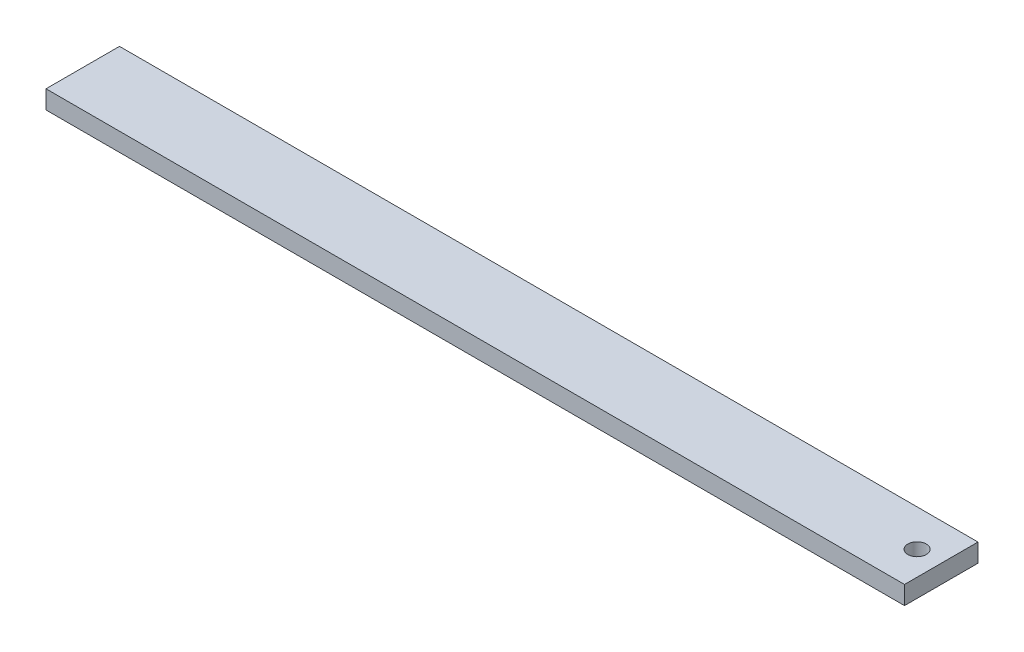
ISO-10303-21;
HEADER;
FILE_DESCRIPTION(('STEP AP214'),'2;1');
FILE_NAME('part.step','',(''),(''),'','','');
FILE_SCHEMA(('AUTOMOTIVE_DESIGN { 1 0 10303 214 1 1 1 1 }'));
ENDSEC;
DATA;
#1=APPLICATION_CONTEXT('core data for automotive mechanical design processes');
#2=APPLICATION_PROTOCOL_DEFINITION('international standard','automotive_design',2000,#1);
#3=PRODUCT_CONTEXT('',#1,'mechanical');
#4=PRODUCT('Part','Part','',(#3));
#5=PRODUCT_RELATED_PRODUCT_CATEGORY('part','',(#4));
#6=PRODUCT_DEFINITION_FORMATION('','',#4);
#7=PRODUCT_DEFINITION_CONTEXT('part definition',#1,'design');
#8=PRODUCT_DEFINITION('design','',#6,#7);
#9=PRODUCT_DEFINITION_SHAPE('','',#8);
#10=(LENGTH_UNIT() NAMED_UNIT(*) SI_UNIT(.MILLI.,.METRE.));
#11=(NAMED_UNIT(*) PLANE_ANGLE_UNIT() SI_UNIT($,.RADIAN.));
#12=(NAMED_UNIT(*) SI_UNIT($,.STERADIAN.) SOLID_ANGLE_UNIT());
#13=UNCERTAINTY_MEASURE_WITH_UNIT(LENGTH_MEASURE(1.E-05),#10,'distance_accuracy_value','');
#14=(GEOMETRIC_REPRESENTATION_CONTEXT(3) GLOBAL_UNCERTAINTY_ASSIGNED_CONTEXT((#13)) GLOBAL_UNIT_ASSIGNED_CONTEXT((#10,
#11,#12)) REPRESENTATION_CONTEXT('',''));
#15=CARTESIAN_POINT('',(0.,0.,0.));
#16=DIRECTION('',(0.,0.,1.));
#17=DIRECTION('',(1.,0.,0.));
#18=AXIS2_PLACEMENT_3D('',#15,#16,#17);
#19=CARTESIAN_POINT('',(-140.2,3.,6.));
#20=DIRECTION('',(0.,0.,-1.));
#21=DIRECTION('',(-1.,0.,0.));
#22=AXIS2_PLACEMENT_3D('',#19,#20,#21);
#23=PLANE('',#22);
#24=DIRECTION('',(0.,1.,0.));
#25=VECTOR('',#24,1.);
#26=CARTESIAN_POINT('',(0.,0.,6.));
#27=LINE('',#26,#25);
#28=CARTESIAN_POINT('',(0.,0.,6.));
#29=VERTEX_POINT('',#28);
#30=CARTESIAN_POINT('',(0.,3.,6.));
#31=VERTEX_POINT('',#30);
#32=EDGE_CURVE('E148',#29,#31,#27,.T.);
#33=ORIENTED_EDGE('',*,*,#32,.F.);
#34=DIRECTION('',(1.,0.,0.));
#35=VECTOR('',#34,1.);
#36=CARTESIAN_POINT('',(-140.2,0.,6.));
#37=LINE('',#36,#35);
#38=CARTESIAN_POINT('',(140.2,0.,6.));
#39=VERTEX_POINT('',#38);
#40=EDGE_CURVE('E164',#29,#39,#37,.T.);
#41=ORIENTED_EDGE('',*,*,#40,.T.);
#42=DIRECTION('',(0.,-1.,0.));
#43=VECTOR('',#42,1.);
#44=CARTESIAN_POINT('',(140.2,3.,6.));
#45=LINE('',#44,#43);
#46=CARTESIAN_POINT('',(140.2,3.,6.));
#47=VERTEX_POINT('',#46);
#48=EDGE_CURVE('E167',#47,#39,#45,.T.);
#49=ORIENTED_EDGE('',*,*,#48,.F.);
#50=DIRECTION('',(1.,0.,0.));
#51=VECTOR('',#50,1.);
#52=CARTESIAN_POINT('',(-140.2,3.,6.));
#53=LINE('',#52,#51);
#54=EDGE_CURVE('E166',#31,#47,#53,.T.);
#55=ORIENTED_EDGE('',*,*,#54,.F.);
#56=EDGE_LOOP('',(#33,#41,#49,#55));
#57=FACE_BOUND('',#56,.T.);
#58=ADVANCED_FACE('F39',(#57),#23,.F.);
#59=CARTESIAN_POINT('',(0.,3.,0.));
#60=DIRECTION('',(0.,-1.,0.));
#61=DIRECTION('',(0.,0.,-1.));
#62=AXIS2_PLACEMENT_3D('',#59,#60,#61);
#63=PLANE('',#62);
#64=CARTESIAN_POINT('',(136.25,3.,0.));
#65=DIRECTION('',(0.,1.,0.));
#66=DIRECTION('',(0.,0.,1.));
#67=AXIS2_PLACEMENT_3D('',#64,#65,#66);
#68=CIRCLE('',#67,1.5);
#69=CARTESIAN_POINT('',(136.25,3.,1.49999999999995));
#70=VERTEX_POINT('',#69);
#71=EDGE_CURVE('E155',#70,#70,#68,.T.);
#72=ORIENTED_EDGE('',*,*,#71,.F.);
#73=EDGE_LOOP('',(#72));
#74=FACE_BOUND('',#73,.T.);
#75=DIRECTION('',(0.,0.,-1.));
#76=VECTOR('',#75,1.);
#77=CARTESIAN_POINT('',(0.,3.,6.));
#78=LINE('',#77,#76);
#79=CARTESIAN_POINT('',(0.,3.,-6.));
#80=VERTEX_POINT('',#79);
#81=EDGE_CURVE('E145',#31,#80,#78,.T.);
#82=ORIENTED_EDGE('',*,*,#81,.F.);
#83=ORIENTED_EDGE('',*,*,#54,.T.);
#84=DIRECTION('',(0.,0.,-1.));
#85=VECTOR('',#84,1.);
#86=CARTESIAN_POINT('',(140.2,3.,6.));
#87=LINE('',#86,#85);
#88=CARTESIAN_POINT('',(140.2,3.,-6.));
#89=VERTEX_POINT('',#88);
#90=EDGE_CURVE('E163',#47,#89,#87,.T.);
#91=ORIENTED_EDGE('',*,*,#90,.T.);
#92=DIRECTION('',(-1.,0.,0.));
#93=VECTOR('',#92,1.);
#94=CARTESIAN_POINT('',(-140.2,3.,-6.));
#95=LINE('',#94,#93);
#96=EDGE_CURVE('E165',#89,#80,#95,.T.);
#97=ORIENTED_EDGE('',*,*,#96,.T.);
#98=EDGE_LOOP('',(#82,#83,#91,#97));
#99=FACE_BOUND('',#98,.T.);
#100=ADVANCED_FACE('F231',(#74,#99),#63,.F.);
#101=CARTESIAN_POINT('',(0.,0.,0.));
#102=DIRECTION('',(0.,-1.,0.));
#103=DIRECTION('',(0.,0.,-1.));
#104=AXIS2_PLACEMENT_3D('',#101,#102,#103);
#105=PLANE('',#104);
#106=CARTESIAN_POINT('',(136.25,0.,0.));
#107=DIRECTION('',(0.,1.,0.));
#108=DIRECTION('',(0.,0.,1.));
#109=AXIS2_PLACEMENT_3D('',#106,#107,#108);
#110=CIRCLE('',#109,1.5);
#111=CARTESIAN_POINT('',(136.25,0.,1.49999999999995));
#112=VERTEX_POINT('',#111);
#113=EDGE_CURVE('E151',#112,#112,#110,.T.);
#114=ORIENTED_EDGE('',*,*,#113,.T.);
#115=EDGE_LOOP('',(#114));
#116=FACE_BOUND('',#115,.T.);
#117=ORIENTED_EDGE('',*,*,#40,.F.);
#118=DIRECTION('',(0.,0.,-1.));
#119=VECTOR('',#118,1.);
#120=CARTESIAN_POINT('',(0.,0.,6.));
#121=LINE('',#120,#119);
#122=CARTESIAN_POINT('',(0.,0.,-6.));
#123=VERTEX_POINT('',#122);
#124=EDGE_CURVE('E143',#29,#123,#121,.T.);
#125=ORIENTED_EDGE('',*,*,#124,.T.);
#126=DIRECTION('',(-1.,0.,0.));
#127=VECTOR('',#126,1.);
#128=CARTESIAN_POINT('',(-140.2,0.,-6.));
#129=LINE('',#128,#127);
#130=CARTESIAN_POINT('',(140.2,0.,-6.));
#131=VERTEX_POINT('',#130);
#132=EDGE_CURVE('E173',#131,#123,#129,.T.);
#133=ORIENTED_EDGE('',*,*,#132,.F.);
#134=DIRECTION('',(0.,0.,-1.));
#135=VECTOR('',#134,1.);
#136=CARTESIAN_POINT('',(140.2,0.,6.));
#137=LINE('',#136,#135);
#138=EDGE_CURVE('E157',#39,#131,#137,.T.);
#139=ORIENTED_EDGE('',*,*,#138,.F.);
#140=EDGE_LOOP('',(#117,#125,#133,#139));
#141=FACE_BOUND('',#140,.T.);
#142=ADVANCED_FACE('F239',(#116,#141),#105,.T.);
#143=CARTESIAN_POINT('',(140.2,3.,6.));
#144=DIRECTION('',(-1.,0.,0.));
#145=DIRECTION('',(0.,0.,1.));
#146=AXIS2_PLACEMENT_3D('',#143,#144,#145);
#147=PLANE('',#146);
#148=ORIENTED_EDGE('',*,*,#138,.T.);
#149=DIRECTION('',(0.,-1.,0.));
#150=VECTOR('',#149,1.);
#151=CARTESIAN_POINT('',(140.2,3.,-6.));
#152=LINE('',#151,#150);
#153=EDGE_CURVE('E177',#89,#131,#152,.T.);
#154=ORIENTED_EDGE('',*,*,#153,.F.);
#155=ORIENTED_EDGE('',*,*,#90,.F.);
#156=ORIENTED_EDGE('',*,*,#48,.T.);
#157=EDGE_LOOP('',(#148,#154,#155,#156));
#158=FACE_BOUND('',#157,.T.);
#159=ADVANCED_FACE('F249',(#158),#147,.F.);
#160=CARTESIAN_POINT('',(-140.2,3.,-6.));
#161=DIRECTION('',(0.,0.,1.));
#162=DIRECTION('',(1.,0.,0.));
#163=AXIS2_PLACEMENT_3D('',#160,#161,#162);
#164=PLANE('',#163);
#165=ORIENTED_EDGE('',*,*,#132,.T.);
#166=DIRECTION('',(0.,1.,0.));
#167=VECTOR('',#166,1.);
#168=CARTESIAN_POINT('',(0.,0.,-6.));
#169=LINE('',#168,#167);
#170=EDGE_CURVE('E149',#123,#80,#169,.T.);
#171=ORIENTED_EDGE('',*,*,#170,.T.);
#172=ORIENTED_EDGE('',*,*,#96,.F.);
#173=ORIENTED_EDGE('',*,*,#153,.T.);
#174=EDGE_LOOP('',(#165,#171,#172,#173));
#175=FACE_BOUND('',#174,.T.);
#176=ADVANCED_FACE('F246',(#175),#164,.F.);
#177=CARTESIAN_POINT('',(136.25,0.,0.));
#178=DIRECTION('',(0.,1.,0.));
#179=DIRECTION('',(0.,0.,1.));
#180=AXIS2_PLACEMENT_3D('',#177,#178,#179);
#181=CYLINDRICAL_SURFACE('',#180,1.5);
#182=ORIENTED_EDGE('',*,*,#113,.F.);
#183=EDGE_LOOP('',(#182));
#184=FACE_BOUND('',#183,.T.);
#185=ORIENTED_EDGE('',*,*,#71,.T.);
#186=EDGE_LOOP('',(#185));
#187=FACE_BOUND('',#186,.T.);
#188=ADVANCED_FACE('F248',(#184,#187),#181,.F.);
#189=CARTESIAN_POINT('',(0.,0.,6.));
#190=DIRECTION('',(1.,0.,0.));
#191=DIRECTION('',(0.,0.,-1.));
#192=AXIS2_PLACEMENT_3D('',#189,#190,#191);
#193=PLANE('',#192);
#194=DIRECTION('',(0.,0.,-1.));
#195=VECTOR('',#194,1.);
#196=CARTESIAN_POINT('',(0.,2.475,-0.975));
#197=LINE('',#196,#195);
#198=CARTESIAN_POINT('',(0.,2.475,0.975));
#199=VERTEX_POINT('',#198);
#200=CARTESIAN_POINT('',(0.,2.475,-0.975));
#201=VERTEX_POINT('',#200);
#202=EDGE_CURVE('E123',#199,#201,#197,.T.);
#203=ORIENTED_EDGE('',*,*,#202,.F.);
#204=DIRECTION('',(0.,1.,0.));
#205=VECTOR('',#204,1.);
#206=CARTESIAN_POINT('',(0.,0.525,0.975));
#207=LINE('',#206,#205);
#208=CARTESIAN_POINT('',(0.,0.525,0.975));
#209=VERTEX_POINT('',#208);
#210=EDGE_CURVE('E128',#209,#199,#207,.T.);
#211=ORIENTED_EDGE('',*,*,#210,.F.);
#212=DIRECTION('',(0.,0.,1.));
#213=VECTOR('',#212,1.);
#214=CARTESIAN_POINT('',(0.,0.525,-0.975));
#215=LINE('',#214,#213);
#216=CARTESIAN_POINT('',(0.,0.525,-0.975));
#217=VERTEX_POINT('',#216);
#218=EDGE_CURVE('E131',#217,#209,#215,.T.);
#219=ORIENTED_EDGE('',*,*,#218,.F.);
#220=DIRECTION('',(0.,-1.,0.));
#221=VECTOR('',#220,1.);
#222=CARTESIAN_POINT('',(0.,0.525,-0.975));
#223=LINE('',#222,#221);
#224=EDGE_CURVE('E118',#201,#217,#223,.T.);
#225=ORIENTED_EDGE('',*,*,#224,.F.);
#226=EDGE_LOOP('',(#203,#211,#219,#225));
#227=FACE_BOUND('',#226,.T.);
#228=ORIENTED_EDGE('',*,*,#81,.T.);
#229=ORIENTED_EDGE('',*,*,#170,.F.);
#230=ORIENTED_EDGE('',*,*,#124,.F.);
#231=ORIENTED_EDGE('',*,*,#32,.T.);
#232=EDGE_LOOP('',(#228,#229,#230,#231));
#233=FACE_BOUND('',#232,.T.);
#234=ADVANCED_FACE('F135',(#227,#233),#193,.F.);
#235=CARTESIAN_POINT('',(4.,0.525,0.975));
#236=DIRECTION('',(0.,0.,1.));
#237=DIRECTION('',(1.,0.,0.));
#238=AXIS2_PLACEMENT_3D('',#235,#236,#237);
#239=PLANE('',#238);
#240=DIRECTION('',(-1.,0.,0.));
#241=VECTOR('',#240,1.);
#242=CARTESIAN_POINT('',(4.,2.475,0.975));
#243=LINE('',#242,#241);
#244=CARTESIAN_POINT('',(3.4,2.475,0.975));
#245=VERTEX_POINT('',#244);
#246=EDGE_CURVE('E125',#245,#199,#243,.T.);
#247=ORIENTED_EDGE('',*,*,#246,.F.);
#248=DIRECTION('',(0.,1.,0.));
#249=VECTOR('',#248,1.);
#250=CARTESIAN_POINT('',(3.4,0.525,0.975));
#251=LINE('',#250,#249);
#252=CARTESIAN_POINT('',(3.4,0.525,0.975));
#253=VERTEX_POINT('',#252);
#254=EDGE_CURVE('E11',#245,#253,#251,.F.);
#255=ORIENTED_EDGE('',*,*,#254,.T.);
#256=DIRECTION('',(-1.,0.,0.));
#257=VECTOR('',#256,1.);
#258=CARTESIAN_POINT('',(4.,0.525,0.975));
#259=LINE('',#258,#257);
#260=EDGE_CURVE('E136',#253,#209,#259,.T.);
#261=ORIENTED_EDGE('',*,*,#260,.T.);
#262=ORIENTED_EDGE('',*,*,#210,.T.);
#263=EDGE_LOOP('',(#247,#255,#261,#262));
#264=FACE_BOUND('',#263,.T.);
#265=ADVANCED_FACE('F208',(#264),#239,.F.);
#266=CARTESIAN_POINT('',(4.,0.525,-0.975));
#267=DIRECTION('',(0.,-1.,0.));
#268=DIRECTION('',(0.,0.,-1.));
#269=AXIS2_PLACEMENT_3D('',#266,#267,#268);
#270=PLANE('',#269);
#271=ORIENTED_EDGE('',*,*,#260,.F.);
#272=DIRECTION('',(0.,0.,1.));
#273=VECTOR('',#272,1.);
#274=CARTESIAN_POINT('',(3.4,0.525,-0.975));
#275=LINE('',#274,#273);
#276=CARTESIAN_POINT('',(3.4,0.525,-0.975));
#277=VERTEX_POINT('',#276);
#278=EDGE_CURVE('E192',#253,#277,#275,.F.);
#279=ORIENTED_EDGE('',*,*,#278,.T.);
#280=DIRECTION('',(-1.,0.,0.));
#281=VECTOR('',#280,1.);
#282=CARTESIAN_POINT('',(4.,0.525,-0.975));
#283=LINE('',#282,#281);
#284=EDGE_CURVE('E122',#277,#217,#283,.T.);
#285=ORIENTED_EDGE('',*,*,#284,.T.);
#286=ORIENTED_EDGE('',*,*,#218,.T.);
#287=EDGE_LOOP('',(#271,#279,#285,#286));
#288=FACE_BOUND('',#287,.T.);
#289=ADVANCED_FACE('F211',(#288),#270,.F.);
#290=CARTESIAN_POINT('',(4.,0.525,-0.975));
#291=DIRECTION('',(0.,0.,-1.));
#292=DIRECTION('',(-1.,0.,0.));
#293=AXIS2_PLACEMENT_3D('',#290,#291,#292);
#294=PLANE('',#293);
#295=ORIENTED_EDGE('',*,*,#284,.F.);
#296=DIRECTION('',(0.,-1.,0.));
#297=VECTOR('',#296,1.);
#298=CARTESIAN_POINT('',(3.4,2.475,-0.975));
#299=LINE('',#298,#297);
#300=CARTESIAN_POINT('',(3.4,2.475,-0.975));
#301=VERTEX_POINT('',#300);
#302=EDGE_CURVE('E64',#277,#301,#299,.F.);
#303=ORIENTED_EDGE('',*,*,#302,.T.);
#304=DIRECTION('',(-1.,0.,0.));
#305=VECTOR('',#304,1.);
#306=CARTESIAN_POINT('',(4.,2.475,-0.975));
#307=LINE('',#306,#305);
#308=EDGE_CURVE('E114',#301,#201,#307,.T.);
#309=ORIENTED_EDGE('',*,*,#308,.T.);
#310=ORIENTED_EDGE('',*,*,#224,.T.);
#311=EDGE_LOOP('',(#295,#303,#309,#310));
#312=FACE_BOUND('',#311,.T.);
#313=ADVANCED_FACE('F120',(#312),#294,.F.);
#314=CARTESIAN_POINT('',(4.,2.475,-0.975));
#315=DIRECTION('',(0.,1.,0.));
#316=DIRECTION('',(0.,0.,1.));
#317=AXIS2_PLACEMENT_3D('',#314,#315,#316);
#318=PLANE('',#317);
#319=ORIENTED_EDGE('',*,*,#308,.F.);
#320=DIRECTION('',(0.,0.,-1.));
#321=VECTOR('',#320,1.);
#322=CARTESIAN_POINT('',(3.4,2.475,0.975));
#323=LINE('',#322,#321);
#324=EDGE_CURVE('E48',#301,#245,#323,.F.);
#325=ORIENTED_EDGE('',*,*,#324,.T.);
#326=ORIENTED_EDGE('',*,*,#246,.T.);
#327=ORIENTED_EDGE('',*,*,#202,.T.);
#328=EDGE_LOOP('',(#319,#325,#326,#327));
#329=FACE_BOUND('',#328,.T.);
#330=ADVANCED_FACE('F127',(#329),#318,.F.);
#331=CARTESIAN_POINT('',(4.,0.,0.));
#332=DIRECTION('',(1.,0.,0.));
#333=DIRECTION('',(0.,0.,-1.));
#334=AXIS2_PLACEMENT_3D('',#331,#332,#333);
#335=PLANE('',#334);
#336=DIRECTION('',(0.,-1.,0.));
#337=VECTOR('',#336,1.);
#338=CARTESIAN_POINT('',(4.,0.525,-0.375));
#339=LINE('',#338,#337);
#340=CARTESIAN_POINT('',(4.,1.875,-0.375));
#341=VERTEX_POINT('',#340);
#342=CARTESIAN_POINT('',(4.,1.125,-0.375));
#343=VERTEX_POINT('',#342);
#344=EDGE_CURVE('E187',#341,#343,#339,.T.);
#345=ORIENTED_EDGE('',*,*,#344,.T.);
#346=DIRECTION('',(0.,0.,1.));
#347=VECTOR('',#346,1.);
#348=CARTESIAN_POINT('',(4.,1.125,0.975));
#349=LINE('',#348,#347);
#350=CARTESIAN_POINT('',(4.,1.125,0.375));
#351=VERTEX_POINT('',#350);
#352=EDGE_CURVE('E189',#343,#351,#349,.T.);
#353=ORIENTED_EDGE('',*,*,#352,.T.);
#354=DIRECTION('',(0.,1.,0.));
#355=VECTOR('',#354,1.);
#356=CARTESIAN_POINT('',(4.,2.475,0.375));
#357=LINE('',#356,#355);
#358=CARTESIAN_POINT('',(4.,1.875,0.375));
#359=VERTEX_POINT('',#358);
#360=EDGE_CURVE('E185',#351,#359,#357,.T.);
#361=ORIENTED_EDGE('',*,*,#360,.T.);
#362=DIRECTION('',(0.,0.,-1.));
#363=VECTOR('',#362,1.);
#364=CARTESIAN_POINT('',(4.,1.875,-0.975));
#365=LINE('',#364,#363);
#366=EDGE_CURVE('E183',#359,#341,#365,.T.);
#367=ORIENTED_EDGE('',*,*,#366,.T.);
#368=EDGE_LOOP('',(#345,#353,#361,#367));
#369=FACE_BOUND('',#368,.T.);
#370=ADVANCED_FACE('F222',(#369),#335,.F.);
#371=CARTESIAN_POINT('',(3.4,1.875,0.));
#372=DIRECTION('',(0.,0.,1.));
#373=DIRECTION('',(1.,0.,0.));
#374=AXIS2_PLACEMENT_3D('',#371,#372,#373);
#375=CYLINDRICAL_SURFACE('',#374,0.6);
#376=CARTESIAN_POINT('',(3.4,1.875,0.375));
#377=DIRECTION('',(0.,-0.707106781186547,0.707106781186547));
#378=DIRECTION('',(0.,0.707106781186547,0.707106781186547));
#379=AXIS2_PLACEMENT_3D('',#376,#377,#378);
#380=ELLIPSE('',#379,0.848528137423857,0.6);
#381=EDGE_CURVE('E199',#245,#359,#380,.F.);
#382=ORIENTED_EDGE('',*,*,#381,.F.);
#383=ORIENTED_EDGE('',*,*,#324,.F.);
#384=CARTESIAN_POINT('',(3.4,1.875,-0.375));
#385=DIRECTION('',(0.,0.707106781186547,0.707106781186547));
#386=DIRECTION('',(0.,0.707106781186547,-0.707106781186547));
#387=AXIS2_PLACEMENT_3D('',#384,#385,#386);
#388=ELLIPSE('',#387,0.848528137423857,0.6);
#389=EDGE_CURVE('E43',#341,#301,#388,.T.);
#390=ORIENTED_EDGE('',*,*,#389,.F.);
#391=ORIENTED_EDGE('',*,*,#366,.F.);
#392=EDGE_LOOP('',(#382,#383,#390,#391));
#393=FACE_BOUND('',#392,.T.);
#394=ADVANCED_FACE('F41',(#393),#375,.F.);
#395=CARTESIAN_POINT('',(3.4,0.,-0.375));
#396=DIRECTION('',(0.,1.,0.));
#397=DIRECTION('',(0.,0.,1.));
#398=AXIS2_PLACEMENT_3D('',#395,#396,#397);
#399=CYLINDRICAL_SURFACE('',#398,0.6);
#400=ORIENTED_EDGE('',*,*,#389,.T.);
#401=ORIENTED_EDGE('',*,*,#302,.F.);
#402=CARTESIAN_POINT('',(3.4,1.125,-0.375));
#403=DIRECTION('',(0.,0.707106781186547,-0.707106781186548));
#404=DIRECTION('',(0.,-0.707106781186548,-0.707106781186547));
#405=AXIS2_PLACEMENT_3D('',#402,#403,#404);
#406=ELLIPSE('',#405,0.848528137423857,0.6);
#407=EDGE_CURVE('E198',#343,#277,#406,.T.);
#408=ORIENTED_EDGE('',*,*,#407,.F.);
#409=ORIENTED_EDGE('',*,*,#344,.F.);
#410=EDGE_LOOP('',(#400,#401,#408,#409));
#411=FACE_BOUND('',#410,.T.);
#412=ADVANCED_FACE('F225',(#411),#399,.F.);
#413=CARTESIAN_POINT('',(3.4,0.,0.375));
#414=DIRECTION('',(0.,-1.,0.));
#415=DIRECTION('',(0.,0.,-1.));
#416=AXIS2_PLACEMENT_3D('',#413,#414,#415);
#417=CYLINDRICAL_SURFACE('',#416,0.6);
#418=ORIENTED_EDGE('',*,*,#381,.T.);
#419=ORIENTED_EDGE('',*,*,#360,.F.);
#420=CARTESIAN_POINT('',(3.4,1.125,0.375));
#421=DIRECTION('',(0.,-0.707106781186548,-0.707106781186547));
#422=DIRECTION('',(0.,0.707106781186547,-0.707106781186548));
#423=AXIS2_PLACEMENT_3D('',#420,#421,#422);
#424=ELLIPSE('',#423,0.848528137423857,0.6);
#425=EDGE_CURVE('E197',#253,#351,#424,.F.);
#426=ORIENTED_EDGE('',*,*,#425,.F.);
#427=ORIENTED_EDGE('',*,*,#254,.F.);
#428=EDGE_LOOP('',(#418,#419,#426,#427));
#429=FACE_BOUND('',#428,.T.);
#430=ADVANCED_FACE('F216',(#429),#417,.F.);
#431=CARTESIAN_POINT('',(3.4,1.125,0.));
#432=DIRECTION('',(0.,0.,-1.));
#433=DIRECTION('',(0.,1.,0.));
#434=AXIS2_PLACEMENT_3D('',#431,#432,#433);
#435=CYLINDRICAL_SURFACE('',#434,0.6);
#436=ORIENTED_EDGE('',*,*,#407,.T.);
#437=ORIENTED_EDGE('',*,*,#278,.F.);
#438=ORIENTED_EDGE('',*,*,#425,.T.);
#439=ORIENTED_EDGE('',*,*,#352,.F.);
#440=EDGE_LOOP('',(#436,#437,#438,#439));
#441=FACE_BOUND('',#440,.T.);
#442=ADVANCED_FACE('F220',(#441),#435,.F.);
#443=CLOSED_SHELL('',(#58,#100,#142,#159,#176,#188,#234,#265,#289,#313,#330,#370,#394,#412,#430,#442));
#444=MANIFOLD_SOLID_BREP('B2',#443);
#445=ADVANCED_BREP_SHAPE_REPRESENTATION('',(#18,#444),#14);
#446=SHAPE_DEFINITION_REPRESENTATION(#9,#445);
ENDSEC;
END-ISO-10303-21;
